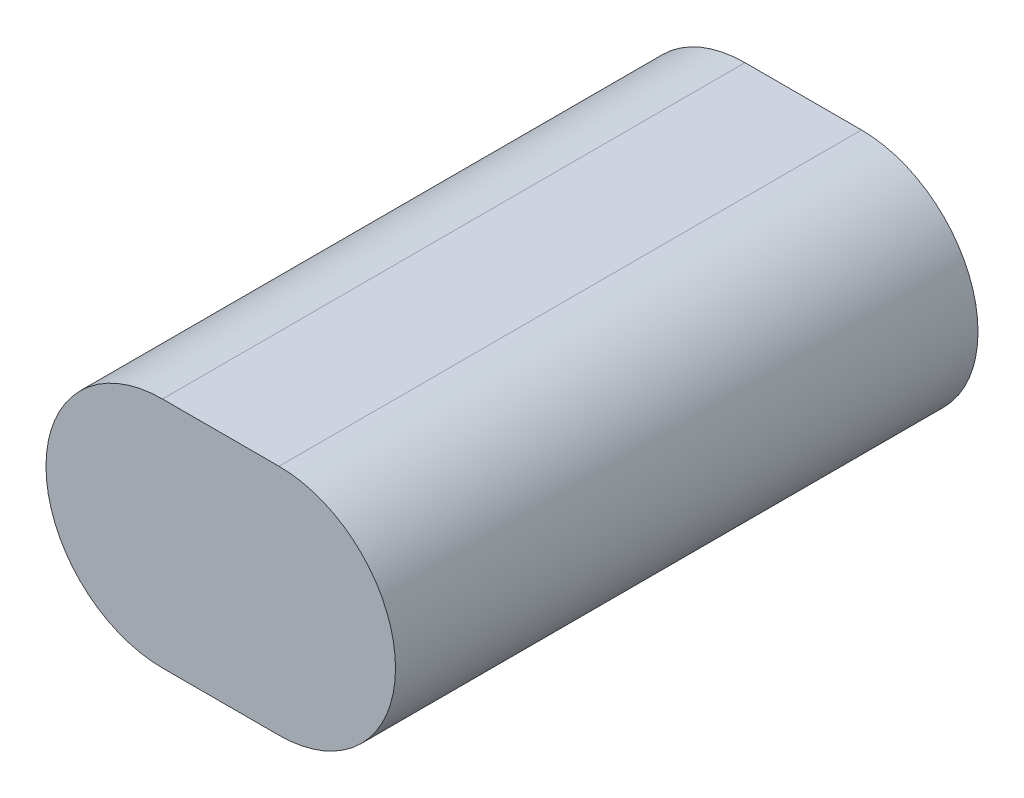
ISO-10303-21;
HEADER;
FILE_DESCRIPTION(('STEP AP214'),'2;1');
FILE_NAME('part.step','',(''),(''),'','','');
FILE_SCHEMA(('AUTOMOTIVE_DESIGN { 1 0 10303 214 1 1 1 1 }'));
ENDSEC;
DATA;
#1=APPLICATION_CONTEXT('core data for automotive mechanical design processes');
#2=APPLICATION_PROTOCOL_DEFINITION('international standard','automotive_design',2000,#1);
#3=PRODUCT_CONTEXT('',#1,'mechanical');
#4=PRODUCT('Part','Part','',(#3));
#5=PRODUCT_RELATED_PRODUCT_CATEGORY('part','',(#4));
#6=PRODUCT_DEFINITION_FORMATION('','',#4);
#7=PRODUCT_DEFINITION_CONTEXT('part definition',#1,'design');
#8=PRODUCT_DEFINITION('design','',#6,#7);
#9=PRODUCT_DEFINITION_SHAPE('','',#8);
#10=(LENGTH_UNIT() NAMED_UNIT(*) SI_UNIT(.MILLI.,.METRE.));
#11=(NAMED_UNIT(*) PLANE_ANGLE_UNIT() SI_UNIT($,.RADIAN.));
#12=(NAMED_UNIT(*) SI_UNIT($,.STERADIAN.) SOLID_ANGLE_UNIT());
#13=UNCERTAINTY_MEASURE_WITH_UNIT(LENGTH_MEASURE(1.E-05),#10,'distance_accuracy_value','');
#14=(GEOMETRIC_REPRESENTATION_CONTEXT(3) GLOBAL_UNCERTAINTY_ASSIGNED_CONTEXT((#13)) GLOBAL_UNIT_ASSIGNED_CONTEXT((#10,
#11,#12)) REPRESENTATION_CONTEXT('',''));
#15=CARTESIAN_POINT('',(0.,0.,0.));
#16=DIRECTION('',(0.,0.,1.));
#17=DIRECTION('',(1.,0.,0.));
#18=AXIS2_PLACEMENT_3D('',#15,#16,#17);
#19=CARTESIAN_POINT('',(0.,0.,100.));
#20=DIRECTION('',(0.,0.,-1.));
#21=DIRECTION('',(-1.,0.,0.));
#22=AXIS2_PLACEMENT_3D('',#19,#20,#21);
#23=CYLINDRICAL_SURFACE('',#22,20.);
#24=CARTESIAN_POINT('',(0.,0.,0.));
#25=DIRECTION('',(0.,0.,1.));
#26=DIRECTION('',(1.,0.,0.));
#27=AXIS2_PLACEMENT_3D('',#24,#25,#26);
#28=CIRCLE('',#27,20.);
#29=CARTESIAN_POINT('',(0.,20.,0.));
#30=VERTEX_POINT('',#29);
#31=CARTESIAN_POINT('',(0.,-20.,0.));
#32=VERTEX_POINT('',#31);
#33=EDGE_CURVE('E100',#30,#32,#28,.T.);
#34=ORIENTED_EDGE('',*,*,#33,.T.);
#35=DIRECTION('',(0.,0.,-1.));
#36=VECTOR('',#35,1.);
#37=CARTESIAN_POINT('',(0.,-20.,100.));
#38=LINE('',#37,#36);
#39=CARTESIAN_POINT('',(0.,-20.,100.));
#40=VERTEX_POINT('',#39);
#41=EDGE_CURVE('E11',#40,#32,#38,.T.);
#42=ORIENTED_EDGE('',*,*,#41,.F.);
#43=CARTESIAN_POINT('',(0.,0.,100.));
#44=DIRECTION('',(0.,0.,1.));
#45=DIRECTION('',(1.,0.,0.));
#46=AXIS2_PLACEMENT_3D('',#43,#44,#45);
#47=CIRCLE('',#46,20.);
#48=CARTESIAN_POINT('',(0.,20.,100.));
#49=VERTEX_POINT('',#48);
#50=EDGE_CURVE('E88',#49,#40,#47,.T.);
#51=ORIENTED_EDGE('',*,*,#50,.F.);
#52=DIRECTION('',(0.,0.,-1.));
#53=VECTOR('',#52,1.);
#54=CARTESIAN_POINT('',(0.,20.,100.));
#55=LINE('',#54,#53);
#56=EDGE_CURVE('E96',#49,#30,#55,.T.);
#57=ORIENTED_EDGE('',*,*,#56,.T.);
#58=EDGE_LOOP('',(#34,#42,#51,#57));
#59=FACE_BOUND('',#58,.T.);
#60=ADVANCED_FACE('F37',(#59),#23,.T.);
#61=CARTESIAN_POINT('',(0.,-20.,100.));
#62=DIRECTION('',(0.,1.,0.));
#63=DIRECTION('',(0.,0.,1.));
#64=AXIS2_PLACEMENT_3D('',#61,#62,#63);
#65=PLANE('',#64);
#66=DIRECTION('',(1.,0.,0.));
#67=VECTOR('',#66,1.);
#68=CARTESIAN_POINT('',(0.,-20.,0.));
#69=LINE('',#68,#67);
#70=CARTESIAN_POINT('',(20.,-20.,0.));
#71=VERTEX_POINT('',#70);
#72=EDGE_CURVE('E92',#32,#71,#69,.T.);
#73=ORIENTED_EDGE('',*,*,#72,.T.);
#74=DIRECTION('',(0.,0.,-1.));
#75=VECTOR('',#74,1.);
#76=CARTESIAN_POINT('',(20.,-20.,100.));
#77=LINE('',#76,#75);
#78=CARTESIAN_POINT('',(20.,-20.,100.));
#79=VERTEX_POINT('',#78);
#80=EDGE_CURVE('E45',#79,#71,#77,.T.);
#81=ORIENTED_EDGE('',*,*,#80,.F.);
#82=DIRECTION('',(1.,0.,0.));
#83=VECTOR('',#82,1.);
#84=CARTESIAN_POINT('',(0.,-20.,100.));
#85=LINE('',#84,#83);
#86=EDGE_CURVE('E83',#40,#79,#85,.T.);
#87=ORIENTED_EDGE('',*,*,#86,.F.);
#88=ORIENTED_EDGE('',*,*,#41,.T.);
#89=EDGE_LOOP('',(#73,#81,#87,#88));
#90=FACE_BOUND('',#89,.T.);
#91=ADVANCED_FACE('F91',(#90),#65,.F.);
#92=CARTESIAN_POINT('',(20.,0.,100.));
#93=DIRECTION('',(0.,0.,-1.));
#94=DIRECTION('',(-1.,0.,0.));
#95=AXIS2_PLACEMENT_3D('',#92,#93,#94);
#96=CYLINDRICAL_SURFACE('',#95,20.);
#97=CARTESIAN_POINT('',(20.,0.,0.));
#98=DIRECTION('',(0.,0.,1.));
#99=DIRECTION('',(1.,0.,0.));
#100=AXIS2_PLACEMENT_3D('',#97,#98,#99);
#101=CIRCLE('',#100,20.);
#102=CARTESIAN_POINT('',(20.,20.,0.));
#103=VERTEX_POINT('',#102);
#104=EDGE_CURVE('E70',#71,#103,#101,.T.);
#105=ORIENTED_EDGE('',*,*,#104,.T.);
#106=DIRECTION('',(0.,0.,-1.));
#107=VECTOR('',#106,1.);
#108=CARTESIAN_POINT('',(20.,20.,100.));
#109=LINE('',#108,#107);
#110=CARTESIAN_POINT('',(20.,20.,100.));
#111=VERTEX_POINT('',#110);
#112=EDGE_CURVE('E93',#111,#103,#109,.T.);
#113=ORIENTED_EDGE('',*,*,#112,.F.);
#114=CARTESIAN_POINT('',(20.,0.,100.));
#115=DIRECTION('',(0.,0.,1.));
#116=DIRECTION('',(1.,0.,0.));
#117=AXIS2_PLACEMENT_3D('',#114,#115,#116);
#118=CIRCLE('',#117,20.);
#119=EDGE_CURVE('E86',#79,#111,#118,.T.);
#120=ORIENTED_EDGE('',*,*,#119,.F.);
#121=ORIENTED_EDGE('',*,*,#80,.T.);
#122=EDGE_LOOP('',(#105,#113,#120,#121));
#123=FACE_BOUND('',#122,.T.);
#124=ADVANCED_FACE('F94',(#123),#96,.T.);
#125=CARTESIAN_POINT('',(0.,20.,100.));
#126=DIRECTION('',(0.,-1.,0.));
#127=DIRECTION('',(0.,0.,-1.));
#128=AXIS2_PLACEMENT_3D('',#125,#126,#127);
#129=PLANE('',#128);
#130=DIRECTION('',(-1.,0.,0.));
#131=VECTOR('',#130,1.);
#132=CARTESIAN_POINT('',(0.,20.,0.));
#133=LINE('',#132,#131);
#134=EDGE_CURVE('E76',#103,#30,#133,.T.);
#135=ORIENTED_EDGE('',*,*,#134,.T.);
#136=ORIENTED_EDGE('',*,*,#56,.F.);
#137=DIRECTION('',(-1.,0.,0.));
#138=VECTOR('',#137,1.);
#139=CARTESIAN_POINT('',(0.,20.,100.));
#140=LINE('',#139,#138);
#141=EDGE_CURVE('E53',#111,#49,#140,.T.);
#142=ORIENTED_EDGE('',*,*,#141,.F.);
#143=ORIENTED_EDGE('',*,*,#112,.T.);
#144=EDGE_LOOP('',(#135,#136,#142,#143));
#145=FACE_BOUND('',#144,.T.);
#146=ADVANCED_FACE('F107',(#145),#129,.F.);
#147=CARTESIAN_POINT('',(0.,0.,100.));
#148=DIRECTION('',(0.,0.,1.));
#149=DIRECTION('',(1.,0.,0.));
#150=AXIS2_PLACEMENT_3D('',#147,#148,#149);
#151=PLANE('',#150);
#152=ORIENTED_EDGE('',*,*,#50,.T.);
#153=ORIENTED_EDGE('',*,*,#86,.T.);
#154=ORIENTED_EDGE('',*,*,#119,.T.);
#155=ORIENTED_EDGE('',*,*,#141,.T.);
#156=EDGE_LOOP('',(#152,#153,#154,#155));
#157=FACE_BOUND('',#156,.T.);
#158=ADVANCED_FACE('F84',(#157),#151,.T.);
#159=CARTESIAN_POINT('',(0.,0.,0.));
#160=DIRECTION('',(0.,0.,1.));
#161=DIRECTION('',(1.,0.,0.));
#162=AXIS2_PLACEMENT_3D('',#159,#160,#161);
#163=PLANE('',#162);
#164=ORIENTED_EDGE('',*,*,#33,.F.);
#165=ORIENTED_EDGE('',*,*,#134,.F.);
#166=ORIENTED_EDGE('',*,*,#104,.F.);
#167=ORIENTED_EDGE('',*,*,#72,.F.);
#168=EDGE_LOOP('',(#164,#165,#166,#167));
#169=FACE_BOUND('',#168,.T.);
#170=ADVANCED_FACE('F110',(#169),#163,.F.);
#171=CLOSED_SHELL('',(#60,#91,#124,#146,#158,#170));
#172=MANIFOLD_SOLID_BREP('B2',#171);
#173=ADVANCED_BREP_SHAPE_REPRESENTATION('',(#18,#172),#14);
#174=SHAPE_DEFINITION_REPRESENTATION(#9,#173);
ENDSEC;
END-ISO-10303-21;
